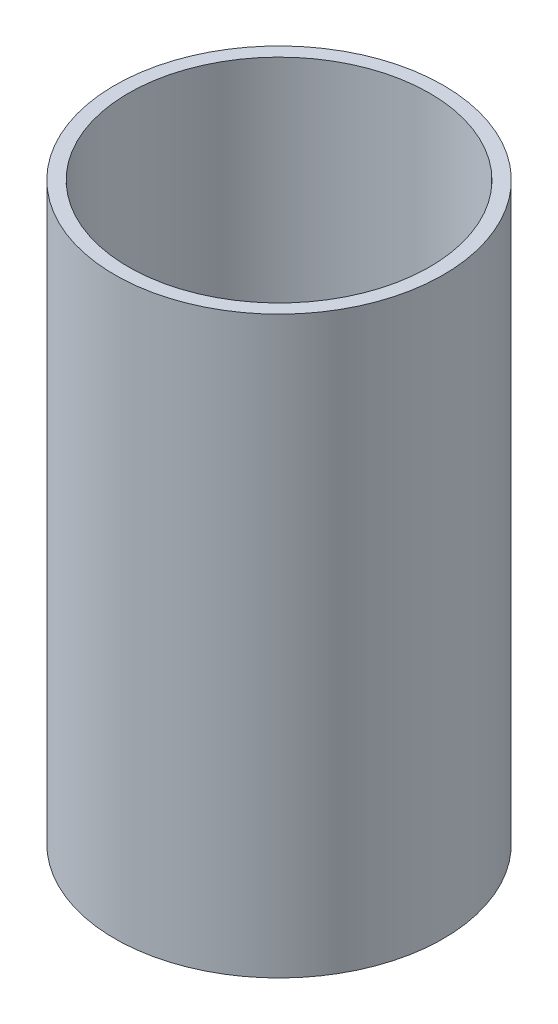
ISO-10303-21;
HEADER;
FILE_DESCRIPTION(('STEP AP214'),'2;1');
FILE_NAME('part.step','',(''),(''),'','','');
FILE_SCHEMA(('AUTOMOTIVE_DESIGN { 1 0 10303 214 1 1 1 1 }'));
ENDSEC;
DATA;
#1=APPLICATION_CONTEXT('core data for automotive mechanical design processes');
#2=APPLICATION_PROTOCOL_DEFINITION('international standard','automotive_design',2000,#1);
#3=PRODUCT_CONTEXT('',#1,'mechanical');
#4=PRODUCT('Part','Part','',(#3));
#5=PRODUCT_RELATED_PRODUCT_CATEGORY('part','',(#4));
#6=PRODUCT_DEFINITION_FORMATION('','',#4);
#7=PRODUCT_DEFINITION_CONTEXT('part definition',#1,'design');
#8=PRODUCT_DEFINITION('design','',#6,#7);
#9=PRODUCT_DEFINITION_SHAPE('','',#8);
#10=(LENGTH_UNIT() NAMED_UNIT(*) SI_UNIT(.MILLI.,.METRE.));
#11=(NAMED_UNIT(*) PLANE_ANGLE_UNIT() SI_UNIT($,.RADIAN.));
#12=(NAMED_UNIT(*) SI_UNIT($,.STERADIAN.) SOLID_ANGLE_UNIT());
#13=UNCERTAINTY_MEASURE_WITH_UNIT(LENGTH_MEASURE(1.E-05),#10,'distance_accuracy_value','');
#14=(GEOMETRIC_REPRESENTATION_CONTEXT(3) GLOBAL_UNCERTAINTY_ASSIGNED_CONTEXT((#13)) GLOBAL_UNIT_ASSIGNED_CONTEXT((#10,
#11,#12)) REPRESENTATION_CONTEXT('',''));
#15=CARTESIAN_POINT('',(0.,0.,0.));
#16=DIRECTION('',(0.,0.,1.));
#17=DIRECTION('',(1.,0.,0.));
#18=AXIS2_PLACEMENT_3D('',#15,#16,#17);
#19=CARTESIAN_POINT('',(0.,42.,0.));
#20=DIRECTION('',(0.,1.,0.));
#21=DIRECTION('',(0.,0.,1.));
#22=AXIS2_PLACEMENT_3D('',#19,#20,#21);
#23=PLANE('',#22);
#24=CARTESIAN_POINT('',(0.,42.,0.));
#25=DIRECTION('',(0.,1.,0.));
#26=DIRECTION('',(0.,0.,1.));
#27=AXIS2_PLACEMENT_3D('',#24,#25,#26);
#28=CIRCLE('',#27,12.);
#29=CARTESIAN_POINT('',(0.,42.,-12.));
#30=VERTEX_POINT('',#29);
#31=EDGE_CURVE('E10',#30,#30,#28,.T.);
#32=ORIENTED_EDGE('',*,*,#31,.T.);
#33=EDGE_LOOP('',(#32));
#34=FACE_BOUND('',#33,.T.);
#35=CARTESIAN_POINT('',(0.,42.,0.));
#36=DIRECTION('',(0.,1.,0.));
#37=DIRECTION('',(0.,0.,1.));
#38=AXIS2_PLACEMENT_3D('',#35,#36,#37);
#39=CIRCLE('',#38,11.);
#40=CARTESIAN_POINT('',(0.,42.,-11.));
#41=VERTEX_POINT('',#40);
#42=EDGE_CURVE('E48',#41,#41,#39,.T.);
#43=ORIENTED_EDGE('',*,*,#42,.F.);
#44=EDGE_LOOP('',(#43));
#45=FACE_BOUND('',#44,.T.);
#46=ADVANCED_FACE('F37',(#34,#45),#23,.T.);
#47=CARTESIAN_POINT('',(0.,0.,0.));
#48=DIRECTION('',(0.,1.,0.));
#49=DIRECTION('',(0.,0.,1.));
#50=AXIS2_PLACEMENT_3D('',#47,#48,#49);
#51=PLANE('',#50);
#52=CARTESIAN_POINT('',(0.,0.,0.));
#53=DIRECTION('',(0.,1.,0.));
#54=DIRECTION('',(0.,0.,1.));
#55=AXIS2_PLACEMENT_3D('',#52,#53,#54);
#56=CIRCLE('',#55,12.);
#57=CARTESIAN_POINT('',(0.,0.,-12.));
#58=VERTEX_POINT('',#57);
#59=EDGE_CURVE('E41',#58,#58,#56,.T.);
#60=ORIENTED_EDGE('',*,*,#59,.F.);
#61=EDGE_LOOP('',(#60));
#62=FACE_BOUND('',#61,.T.);
#63=CARTESIAN_POINT('',(0.,0.,0.));
#64=DIRECTION('',(0.,1.,0.));
#65=DIRECTION('',(0.,0.,1.));
#66=AXIS2_PLACEMENT_3D('',#63,#64,#65);
#67=CIRCLE('',#66,11.);
#68=CARTESIAN_POINT('',(0.,0.,-11.));
#69=VERTEX_POINT('',#68);
#70=EDGE_CURVE('E50',#69,#69,#67,.T.);
#71=ORIENTED_EDGE('',*,*,#70,.T.);
#72=EDGE_LOOP('',(#71));
#73=FACE_BOUND('',#72,.T.);
#74=ADVANCED_FACE('F60',(#62,#73),#51,.F.);
#75=CARTESIAN_POINT('',(0.,42.,0.));
#76=DIRECTION('',(0.,-1.,0.));
#77=DIRECTION('',(0.,0.,-1.));
#78=AXIS2_PLACEMENT_3D('',#75,#76,#77);
#79=CYLINDRICAL_SURFACE('',#78,12.);
#80=CARTESIAN_POINT('',(0.,42.,-12.));
#81=CARTESIAN_POINT('',(0.,41.5625,-12.));
#82=CARTESIAN_POINT('',(0.,41.125,-12.));
#83=CARTESIAN_POINT('',(0.,40.25,-12.));
#84=CARTESIAN_POINT('',(0.,39.8125,-12.));
#85=CARTESIAN_POINT('',(0.,38.9375,-12.));
#86=CARTESIAN_POINT('',(0.,38.5,-12.));
#87=CARTESIAN_POINT('',(0.,37.625,-12.));
#88=CARTESIAN_POINT('',(0.,37.1875,-12.));
#89=CARTESIAN_POINT('',(0.,36.3125,-12.));
#90=CARTESIAN_POINT('',(0.,35.875,-12.));
#91=CARTESIAN_POINT('',(0.,35.,-12.));
#92=CARTESIAN_POINT('',(0.,34.5625,-12.));
#93=CARTESIAN_POINT('',(0.,33.6875,-12.));
#94=CARTESIAN_POINT('',(0.,33.25,-12.));
#95=CARTESIAN_POINT('',(0.,32.375,-12.));
#96=CARTESIAN_POINT('',(0.,31.9375,-12.));
#97=CARTESIAN_POINT('',(0.,31.0625,-12.));
#98=CARTESIAN_POINT('',(0.,30.625,-12.));
#99=CARTESIAN_POINT('',(0.,29.75,-12.));
#100=CARTESIAN_POINT('',(0.,29.3125,-12.));
#101=CARTESIAN_POINT('',(0.,28.4375,-12.));
#102=CARTESIAN_POINT('',(0.,28.,-12.));
#103=CARTESIAN_POINT('',(0.,27.125,-12.));
#104=CARTESIAN_POINT('',(0.,26.6875,-12.));
#105=CARTESIAN_POINT('',(0.,25.8125,-12.));
#106=CARTESIAN_POINT('',(0.,25.375,-12.));
#107=CARTESIAN_POINT('',(0.,24.5,-12.));
#108=CARTESIAN_POINT('',(0.,24.0625,-12.));
#109=CARTESIAN_POINT('',(0.,23.1875,-12.));
#110=CARTESIAN_POINT('',(0.,22.75,-12.));
#111=CARTESIAN_POINT('',(0.,21.875,-12.));
#112=CARTESIAN_POINT('',(0.,21.4375,-12.));
#113=CARTESIAN_POINT('',(0.,20.5625,-12.));
#114=CARTESIAN_POINT('',(0.,20.125,-12.));
#115=CARTESIAN_POINT('',(0.,19.25,-12.));
#116=CARTESIAN_POINT('',(0.,18.8125,-12.));
#117=CARTESIAN_POINT('',(0.,17.9375,-12.));
#118=CARTESIAN_POINT('',(0.,17.5,-12.));
#119=CARTESIAN_POINT('',(0.,16.625,-12.));
#120=CARTESIAN_POINT('',(0.,16.1875,-12.));
#121=CARTESIAN_POINT('',(0.,15.3125,-12.));
#122=CARTESIAN_POINT('',(0.,14.875,-12.));
#123=CARTESIAN_POINT('',(0.,14.,-12.));
#124=CARTESIAN_POINT('',(0.,13.5625,-12.));
#125=CARTESIAN_POINT('',(0.,12.6875,-12.));
#126=CARTESIAN_POINT('',(0.,12.25,-12.));
#127=CARTESIAN_POINT('',(0.,11.375,-12.));
#128=CARTESIAN_POINT('',(0.,10.9375,-12.));
#129=CARTESIAN_POINT('',(0.,10.0625,-12.));
#130=CARTESIAN_POINT('',(0.,9.625,-12.));
#131=CARTESIAN_POINT('',(0.,8.75,-12.));
#132=CARTESIAN_POINT('',(0.,8.3125,-12.));
#133=CARTESIAN_POINT('',(0.,7.4375,-12.));
#134=CARTESIAN_POINT('',(0.,7.,-12.));
#135=CARTESIAN_POINT('',(0.,6.125,-12.));
#136=CARTESIAN_POINT('',(0.,5.6875,-12.));
#137=CARTESIAN_POINT('',(0.,4.8125,-12.));
#138=CARTESIAN_POINT('',(0.,4.375,-12.));
#139=CARTESIAN_POINT('',(0.,3.5,-12.));
#140=CARTESIAN_POINT('',(0.,3.0625,-12.));
#141=CARTESIAN_POINT('',(0.,2.1875,-12.));
#142=CARTESIAN_POINT('',(0.,1.75,-12.));
#143=CARTESIAN_POINT('',(0.,0.875000000000001,-12.));
#144=CARTESIAN_POINT('',(0.,0.4375,-12.));
#145=CARTESIAN_POINT('',(0.,0.,-12.));
#146=B_SPLINE_CURVE_WITH_KNOTS('',3,(#80,#81,#82,#83,#84,#85,#86,#87,#88,#89,#90,#91,#92,#93,
#94,#95,#96,#97,#98,#99,#100,#101,#102,#103,#104,#105,#106,#107,#108,#109,#110,#111,#112,#113,
#114,#115,#116,#117,#118,#119,#120,#121,#122,#123,#124,#125,#126,#127,#128,#129,#130,#131,#132,
#133,#134,#135,#136,#137,#138,#139,#140,#141,#142,#143,#144,#145),.UNSPECIFIED.,.F.,.F.,(4,2,2,
2,2,2,2,2,2,2,2,2,2,2,2,2,2,2,2,2,2,2,2,2,2,2,2,2,2,2,2,2,4),(0.,1.31249999999999,2.625,3.9375,
5.25,6.5625,7.87499999999999,9.18749999999999,10.5,11.8125,13.125,14.4375,15.75,17.0625,18.375,
19.6875,21.,22.3125,23.625,24.9375,26.25,27.5625,28.875,30.1875,31.5,32.8125,34.125,35.4375,
36.75,38.0625,39.375,40.6875,42.),.UNSPECIFIED.);
#147=EDGE_CURVE('BSEAM39',#30,#58,#146,.T.);
#148=ORIENTED_EDGE('',*,*,#31,.F.);
#149=ORIENTED_EDGE('',*,*,#59,.T.);
#150=ORIENTED_EDGE('',*,*,#147,.T.);
#151=ORIENTED_EDGE('',*,*,#147,.F.);
#152=EDGE_LOOP('',(#148,#150,#149,#151));
#153=FACE_BOUND('',#152,.T.);
#154=ADVANCED_FACE('F39',(#153),#79,.T.);
#155=CARTESIAN_POINT('',(0.,42.,0.));
#156=DIRECTION('',(0.,-1.,0.));
#157=DIRECTION('',(0.,0.,-1.));
#158=AXIS2_PLACEMENT_3D('',#155,#156,#157);
#159=CYLINDRICAL_SURFACE('',#158,11.);
#160=CARTESIAN_POINT('',(0.,42.,-11.));
#161=CARTESIAN_POINT('',(0.,41.5625,-11.));
#162=CARTESIAN_POINT('',(0.,41.125,-11.));
#163=CARTESIAN_POINT('',(0.,40.25,-11.));
#164=CARTESIAN_POINT('',(0.,39.8125,-11.));
#165=CARTESIAN_POINT('',(0.,38.9375,-11.));
#166=CARTESIAN_POINT('',(0.,38.5,-11.));
#167=CARTESIAN_POINT('',(0.,37.625,-11.));
#168=CARTESIAN_POINT('',(0.,37.1875,-11.));
#169=CARTESIAN_POINT('',(0.,36.3125,-11.));
#170=CARTESIAN_POINT('',(0.,35.875,-11.));
#171=CARTESIAN_POINT('',(0.,35.,-11.));
#172=CARTESIAN_POINT('',(0.,34.5625,-11.));
#173=CARTESIAN_POINT('',(0.,33.6875,-11.));
#174=CARTESIAN_POINT('',(0.,33.25,-11.));
#175=CARTESIAN_POINT('',(0.,32.375,-11.));
#176=CARTESIAN_POINT('',(0.,31.9375,-11.));
#177=CARTESIAN_POINT('',(0.,31.0625,-11.));
#178=CARTESIAN_POINT('',(0.,30.625,-11.));
#179=CARTESIAN_POINT('',(0.,29.75,-11.));
#180=CARTESIAN_POINT('',(0.,29.3125,-11.));
#181=CARTESIAN_POINT('',(0.,28.4375,-11.));
#182=CARTESIAN_POINT('',(0.,28.,-11.));
#183=CARTESIAN_POINT('',(0.,27.125,-11.));
#184=CARTESIAN_POINT('',(0.,26.6875,-11.));
#185=CARTESIAN_POINT('',(0.,25.8125,-11.));
#186=CARTESIAN_POINT('',(0.,25.375,-11.));
#187=CARTESIAN_POINT('',(0.,24.5,-11.));
#188=CARTESIAN_POINT('',(0.,24.0625,-11.));
#189=CARTESIAN_POINT('',(0.,23.1875,-11.));
#190=CARTESIAN_POINT('',(0.,22.75,-11.));
#191=CARTESIAN_POINT('',(0.,21.875,-11.));
#192=CARTESIAN_POINT('',(0.,21.4375,-11.));
#193=CARTESIAN_POINT('',(0.,20.5625,-11.));
#194=CARTESIAN_POINT('',(0.,20.125,-11.));
#195=CARTESIAN_POINT('',(0.,19.25,-11.));
#196=CARTESIAN_POINT('',(0.,18.8125,-11.));
#197=CARTESIAN_POINT('',(0.,17.9375,-11.));
#198=CARTESIAN_POINT('',(0.,17.5,-11.));
#199=CARTESIAN_POINT('',(0.,16.625,-11.));
#200=CARTESIAN_POINT('',(0.,16.1875,-11.));
#201=CARTESIAN_POINT('',(0.,15.3125,-11.));
#202=CARTESIAN_POINT('',(0.,14.875,-11.));
#203=CARTESIAN_POINT('',(0.,14.,-11.));
#204=CARTESIAN_POINT('',(0.,13.5625,-11.));
#205=CARTESIAN_POINT('',(0.,12.6875,-11.));
#206=CARTESIAN_POINT('',(0.,12.25,-11.));
#207=CARTESIAN_POINT('',(0.,11.375,-11.));
#208=CARTESIAN_POINT('',(0.,10.9375,-11.));
#209=CARTESIAN_POINT('',(0.,10.0625,-11.));
#210=CARTESIAN_POINT('',(0.,9.625,-11.));
#211=CARTESIAN_POINT('',(0.,8.75,-11.));
#212=CARTESIAN_POINT('',(0.,8.3125,-11.));
#213=CARTESIAN_POINT('',(0.,7.4375,-11.));
#214=CARTESIAN_POINT('',(0.,7.,-11.));
#215=CARTESIAN_POINT('',(0.,6.125,-11.));
#216=CARTESIAN_POINT('',(0.,5.6875,-11.));
#217=CARTESIAN_POINT('',(0.,4.8125,-11.));
#218=CARTESIAN_POINT('',(0.,4.375,-11.));
#219=CARTESIAN_POINT('',(0.,3.5,-11.));
#220=CARTESIAN_POINT('',(0.,3.0625,-11.));
#221=CARTESIAN_POINT('',(0.,2.1875,-11.));
#222=CARTESIAN_POINT('',(0.,1.75,-11.));
#223=CARTESIAN_POINT('',(0.,0.875000000000001,-11.));
#224=CARTESIAN_POINT('',(0.,0.4375,-11.));
#225=CARTESIAN_POINT('',(0.,0.,-11.));
#226=B_SPLINE_CURVE_WITH_KNOTS('',3,(#160,#161,#162,#163,#164,#165,#166,#167,#168,#169,#170,
#171,#172,#173,#174,#175,#176,#177,#178,#179,#180,#181,#182,#183,#184,#185,#186,#187,#188,#189,
#190,#191,#192,#193,#194,#195,#196,#197,#198,#199,#200,#201,#202,#203,#204,#205,#206,#207,#208,
#209,#210,#211,#212,#213,#214,#215,#216,#217,#218,#219,#220,#221,#222,#223,#224,#225),
.UNSPECIFIED.,.F.,.F.,(4,2,2,2,2,2,2,2,2,2,2,2,2,2,2,2,2,2,2,2,2,2,2,2,2,2,2,2,2,2,2,2,4),(0.,
1.3125,2.625,3.9375,5.25,6.56250000000001,7.875,9.1875,10.5,11.8125,13.125,14.4375,15.75,
17.0625,18.375,19.6875,21.,22.3125,23.625,24.9375,26.25,27.5625,28.875,30.1875,31.5,32.8125,
34.125,35.4375,36.75,38.0625,39.375,40.6875,42.),.UNSPECIFIED.);
#227=EDGE_CURVE('BSEAM56',#41,#69,#226,.T.);
#228=ORIENTED_EDGE('',*,*,#42,.T.);
#229=ORIENTED_EDGE('',*,*,#70,.F.);
#230=ORIENTED_EDGE('',*,*,#227,.T.);
#231=ORIENTED_EDGE('',*,*,#227,.F.);
#232=EDGE_LOOP('',(#228,#230,#229,#231));
#233=FACE_BOUND('',#232,.T.);
#234=ADVANCED_FACE('F56',(#233),#159,.F.);
#235=CLOSED_SHELL('',(#46,#74,#154,#234));
#236=MANIFOLD_SOLID_BREP('B2',#235);
#237=ADVANCED_BREP_SHAPE_REPRESENTATION('',(#18,#236),#14);
#238=SHAPE_DEFINITION_REPRESENTATION(#9,#237);
ENDSEC;
END-ISO-10303-21;
